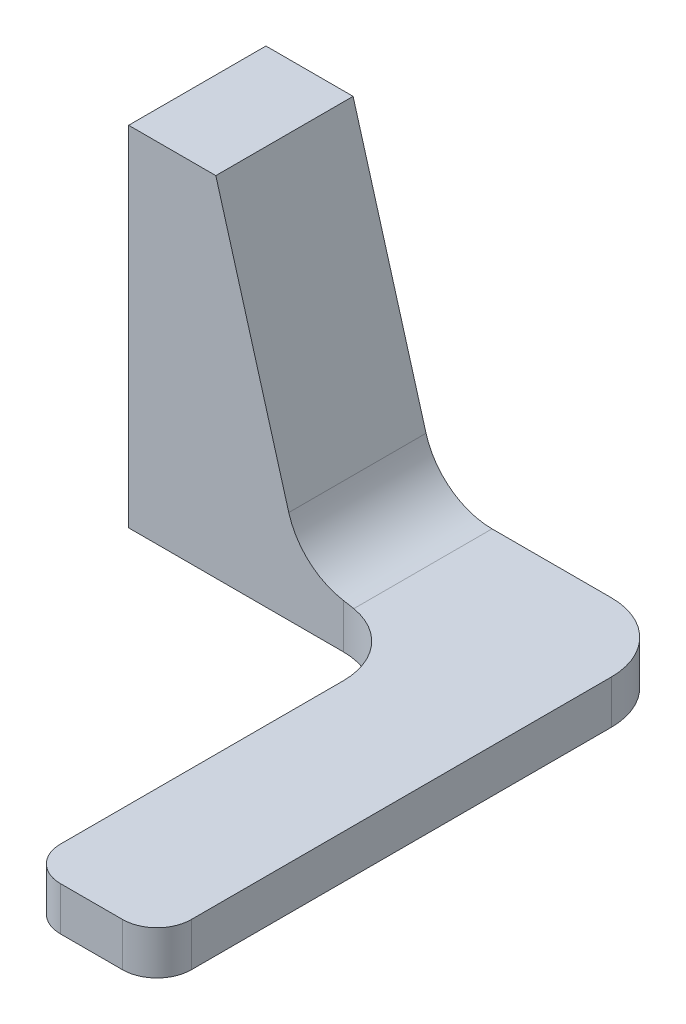
ISO-10303-21;
HEADER;
FILE_DESCRIPTION(('STEP AP214'),'2;1');
FILE_NAME('part.step','',(''),(''),'','','');
FILE_SCHEMA(('AUTOMOTIVE_DESIGN { 1 0 10303 214 1 1 1 1 }'));
ENDSEC;
DATA;
#1=APPLICATION_CONTEXT('core data for automotive mechanical design processes');
#2=APPLICATION_PROTOCOL_DEFINITION('international standard','automotive_design',2000,#1);
#3=PRODUCT_CONTEXT('',#1,'mechanical');
#4=PRODUCT('Part','Part','',(#3));
#5=PRODUCT_RELATED_PRODUCT_CATEGORY('part','',(#4));
#6=PRODUCT_DEFINITION_FORMATION('','',#4);
#7=PRODUCT_DEFINITION_CONTEXT('part definition',#1,'design');
#8=PRODUCT_DEFINITION('design','',#6,#7);
#9=PRODUCT_DEFINITION_SHAPE('','',#8);
#10=(LENGTH_UNIT() NAMED_UNIT(*) SI_UNIT(.MILLI.,.METRE.));
#11=(NAMED_UNIT(*) PLANE_ANGLE_UNIT() SI_UNIT($,.RADIAN.));
#12=(NAMED_UNIT(*) SI_UNIT($,.STERADIAN.) SOLID_ANGLE_UNIT());
#13=UNCERTAINTY_MEASURE_WITH_UNIT(LENGTH_MEASURE(1.E-05),#10,'distance_accuracy_value','');
#14=(GEOMETRIC_REPRESENTATION_CONTEXT(3) GLOBAL_UNCERTAINTY_ASSIGNED_CONTEXT((#13)) GLOBAL_UNIT_ASSIGNED_CONTEXT((#10,
#11,#12)) REPRESENTATION_CONTEXT('',''));
#15=CARTESIAN_POINT('',(0.,0.,0.));
#16=DIRECTION('',(0.,0.,1.));
#17=DIRECTION('',(1.,0.,0.));
#18=AXIS2_PLACEMENT_3D('',#15,#16,#17);
#19=CARTESIAN_POINT('',(41.275,50.8,10.));
#20=DIRECTION('',(0.,0.,-1.));
#21=DIRECTION('',(-1.,0.,0.));
#22=AXIS2_PLACEMENT_3D('',#19,#20,#21);
#23=PLANE('',#22);
#24=DIRECTION('',(1.,0.,0.));
#25=VECTOR('',#24,1.);
#26=CARTESIAN_POINT('',(41.275,0.,10.));
#27=LINE('',#26,#25);
#28=CARTESIAN_POINT('',(0.,0.,10.));
#29=VERTEX_POINT('',#28);
#30=CARTESIAN_POINT('',(31.275,0.,10.));
#31=VERTEX_POINT('',#30);
#32=EDGE_CURVE('E165',#29,#31,#27,.T.);
#33=ORIENTED_EDGE('',*,*,#32,.T.);
#34=DIRECTION('',(0.,-1.,0.));
#35=VECTOR('',#34,1.);
#36=CARTESIAN_POINT('',(31.275,6.35,10.));
#37=LINE('',#36,#35);
#38=CARTESIAN_POINT('',(31.275,6.49009488532902,10.));
#39=VERTEX_POINT('',#38);
#40=EDGE_CURVE('E198',#31,#39,#37,.F.);
#41=ORIENTED_EDGE('',*,*,#40,.T.);
#42=CARTESIAN_POINT('',(32.9430141275436,16.35,10.));
#43=DIRECTION('',(0.,0.,-1.));
#44=DIRECTION('',(-1.,0.,0.));
#45=AXIS2_PLACEMENT_3D('',#42,#43,#44);
#46=CIRCLE('',#45,10.);
#47=CARTESIAN_POINT('',(23.3277746511354,13.6027887210262,10.));
#48=VERTEX_POINT('',#47);
#49=EDGE_CURVE('E136',#39,#48,#46,.T.);
#50=ORIENTED_EDGE('',*,*,#49,.T.);
#51=DIRECTION('',(-0.274721127897378,0.961523947640823,0.));
#52=VECTOR('',#51,1.);
#53=CARTESIAN_POINT('',(14.8566037735849,43.2518867924528,10.));
#54=LINE('',#53,#52);
#55=CARTESIAN_POINT('',(12.7,50.8,9.99999999999999));
#56=VERTEX_POINT('',#55);
#57=EDGE_CURVE('E129',#48,#56,#54,.T.);
#58=ORIENTED_EDGE('',*,*,#57,.T.);
#59=DIRECTION('',(1.,0.,0.));
#60=VECTOR('',#59,1.);
#61=CARTESIAN_POINT('',(41.275,50.8,10.));
#62=LINE('',#61,#60);
#63=CARTESIAN_POINT('',(0.,50.8,10.));
#64=VERTEX_POINT('',#63);
#65=EDGE_CURVE('E134',#64,#56,#62,.T.);
#66=ORIENTED_EDGE('',*,*,#65,.F.);
#67=DIRECTION('',(0.,-1.,0.));
#68=VECTOR('',#67,1.);
#69=CARTESIAN_POINT('',(0.,50.8,10.));
#70=LINE('',#69,#68);
#71=EDGE_CURVE('E164',#64,#29,#70,.T.);
#72=ORIENTED_EDGE('',*,*,#71,.T.);
#73=EDGE_LOOP('',(#33,#41,#50,#58,#66,#72));
#74=FACE_BOUND('',#73,.T.);
#75=ADVANCED_FACE('F33',(#74),#23,.F.);
#76=CARTESIAN_POINT('',(41.275,50.8,66.2));
#77=DIRECTION('',(1.,0.,0.));
#78=DIRECTION('',(0.,0.,-1.));
#79=AXIS2_PLACEMENT_3D('',#76,#77,#78);
#80=PLANE('',#79);
#81=DIRECTION('',(0.,0.,1.));
#82=VECTOR('',#81,1.);
#83=CARTESIAN_POINT('',(41.275,0.,66.2));
#84=LINE('',#83,#82);
#85=CARTESIAN_POINT('',(41.275,0.,20.));
#86=VERTEX_POINT('',#85);
#87=CARTESIAN_POINT('',(41.275,0.,61.2));
#88=VERTEX_POINT('',#87);
#89=EDGE_CURVE('E167',#86,#88,#84,.T.);
#90=ORIENTED_EDGE('',*,*,#89,.T.);
#91=DIRECTION('',(0.,-1.,0.));
#92=VECTOR('',#91,1.);
#93=CARTESIAN_POINT('',(41.275,50.8,61.2));
#94=LINE('',#93,#92);
#95=CARTESIAN_POINT('',(41.275,6.35,61.2));
#96=VERTEX_POINT('',#95);
#97=EDGE_CURVE('E11',#88,#96,#94,.F.);
#98=ORIENTED_EDGE('',*,*,#97,.T.);
#99=DIRECTION('',(0.,0.,-1.));
#100=VECTOR('',#99,1.);
#101=CARTESIAN_POINT('',(41.275,6.35,66.2));
#102=LINE('',#101,#100);
#103=CARTESIAN_POINT('',(41.275,6.35,20.));
#104=VERTEX_POINT('',#103);
#105=EDGE_CURVE('E139',#96,#104,#102,.T.);
#106=ORIENTED_EDGE('',*,*,#105,.T.);
#107=DIRECTION('',(0.,-1.,0.));
#108=VECTOR('',#107,1.);
#109=CARTESIAN_POINT('',(41.275,0.,20.));
#110=LINE('',#109,#108);
#111=EDGE_CURVE('E195',#104,#86,#110,.T.);
#112=ORIENTED_EDGE('',*,*,#111,.T.);
#113=EDGE_LOOP('',(#90,#98,#106,#112));
#114=FACE_BOUND('',#113,.T.);
#115=ADVANCED_FACE('F230',(#114),#80,.F.);
#116=CARTESIAN_POINT('',(60.325,50.8,66.2));
#117=DIRECTION('',(0.,0.,-1.));
#118=DIRECTION('',(-1.,0.,0.));
#119=AXIS2_PLACEMENT_3D('',#116,#117,#118);
#120=PLANE('',#119);
#121=DIRECTION('',(1.,0.,0.));
#122=VECTOR('',#121,1.);
#123=CARTESIAN_POINT('',(60.325,0.,66.2));
#124=LINE('',#123,#122);
#125=CARTESIAN_POINT('',(46.275,0.,66.2));
#126=VERTEX_POINT('',#125);
#127=CARTESIAN_POINT('',(55.325,0.,66.2));
#128=VERTEX_POINT('',#127);
#129=EDGE_CURVE('E169',#126,#128,#124,.T.);
#130=ORIENTED_EDGE('',*,*,#129,.T.);
#131=DIRECTION('',(0.,-1.,0.));
#132=VECTOR('',#131,1.);
#133=CARTESIAN_POINT('',(55.325,50.8,66.2));
#134=LINE('',#133,#132);
#135=CARTESIAN_POINT('',(55.325,6.35,66.2));
#136=VERTEX_POINT('',#135);
#137=EDGE_CURVE('E54',#128,#136,#134,.F.);
#138=ORIENTED_EDGE('',*,*,#137,.T.);
#139=DIRECTION('',(1.,0.,0.));
#140=VECTOR('',#139,1.);
#141=CARTESIAN_POINT('',(25.4,6.35,66.2));
#142=LINE('',#141,#140);
#143=CARTESIAN_POINT('',(46.275,6.35,66.2));
#144=VERTEX_POINT('',#143);
#145=EDGE_CURVE('E264',#144,#136,#142,.T.);
#146=ORIENTED_EDGE('',*,*,#145,.F.);
#147=DIRECTION('',(0.,-1.,0.));
#148=VECTOR('',#147,1.);
#149=CARTESIAN_POINT('',(46.275,50.8,66.2));
#150=LINE('',#149,#148);
#151=EDGE_CURVE('E278',#144,#126,#150,.T.);
#152=ORIENTED_EDGE('',*,*,#151,.T.);
#153=EDGE_LOOP('',(#130,#138,#146,#152));
#154=FACE_BOUND('',#153,.T.);
#155=ADVANCED_FACE('F234',(#154),#120,.F.);
#156=CARTESIAN_POINT('',(60.325,50.8,-10.));
#157=DIRECTION('',(-1.,0.,0.));
#158=DIRECTION('',(0.,0.,1.));
#159=AXIS2_PLACEMENT_3D('',#156,#157,#158);
#160=PLANE('',#159);
#161=DIRECTION('',(0.,0.,1.));
#162=VECTOR('',#161,1.);
#163=CARTESIAN_POINT('',(60.325,6.35,-10.));
#164=LINE('',#163,#162);
#165=CARTESIAN_POINT('',(60.325,6.35,0.));
#166=VERTEX_POINT('',#165);
#167=CARTESIAN_POINT('',(60.325,6.35,61.2));
#168=VERTEX_POINT('',#167);
#169=EDGE_CURVE('E140',#166,#168,#164,.T.);
#170=ORIENTED_EDGE('',*,*,#169,.T.);
#171=DIRECTION('',(0.,-1.,0.));
#172=VECTOR('',#171,1.);
#173=CARTESIAN_POINT('',(60.325,50.8,61.2));
#174=LINE('',#173,#172);
#175=CARTESIAN_POINT('',(60.325,0.,61.2));
#176=VERTEX_POINT('',#175);
#177=EDGE_CURVE('E274',#168,#176,#174,.T.);
#178=ORIENTED_EDGE('',*,*,#177,.T.);
#179=DIRECTION('',(0.,0.,-1.));
#180=VECTOR('',#179,1.);
#181=CARTESIAN_POINT('',(60.325,0.,-10.));
#182=LINE('',#181,#180);
#183=CARTESIAN_POINT('',(60.325,0.,0.));
#184=VERTEX_POINT('',#183);
#185=EDGE_CURVE('E171',#176,#184,#182,.T.);
#186=ORIENTED_EDGE('',*,*,#185,.T.);
#187=DIRECTION('',(0.,-1.,0.));
#188=VECTOR('',#187,1.);
#189=CARTESIAN_POINT('',(60.325,50.8,0.));
#190=LINE('',#189,#188);
#191=EDGE_CURVE('E191',#184,#166,#190,.F.);
#192=ORIENTED_EDGE('',*,*,#191,.T.);
#193=EDGE_LOOP('',(#170,#178,#186,#192));
#194=FACE_BOUND('',#193,.T.);
#195=ADVANCED_FACE('F239',(#194),#160,.F.);
#196=CARTESIAN_POINT('',(0.,50.8,-10.));
#197=DIRECTION('',(0.,0.,1.));
#198=DIRECTION('',(1.,0.,0.));
#199=AXIS2_PLACEMENT_3D('',#196,#197,#198);
#200=PLANE('',#199);
#201=DIRECTION('',(1.,0.,0.));
#202=VECTOR('',#201,1.);
#203=CARTESIAN_POINT('',(25.4,6.35,-10.));
#204=LINE('',#203,#202);
#205=CARTESIAN_POINT('',(32.9430141275436,6.35,-10.));
#206=VERTEX_POINT('',#205);
#207=CARTESIAN_POINT('',(50.325,6.35,-10.));
#208=VERTEX_POINT('',#207);
#209=EDGE_CURVE('E149',#206,#208,#204,.T.);
#210=ORIENTED_EDGE('',*,*,#209,.T.);
#211=DIRECTION('',(0.,-1.,0.));
#212=VECTOR('',#211,1.);
#213=CARTESIAN_POINT('',(50.325,50.8,-10.));
#214=LINE('',#213,#212);
#215=CARTESIAN_POINT('',(50.325,0.,-10.));
#216=VERTEX_POINT('',#215);
#217=EDGE_CURVE('E185',#208,#216,#214,.T.);
#218=ORIENTED_EDGE('',*,*,#217,.T.);
#219=DIRECTION('',(-1.,0.,0.));
#220=VECTOR('',#219,1.);
#221=CARTESIAN_POINT('',(0.,0.,-10.));
#222=LINE('',#221,#220);
#223=CARTESIAN_POINT('',(0.,0.,-10.));
#224=VERTEX_POINT('',#223);
#225=EDGE_CURVE('E159',#216,#224,#222,.T.);
#226=ORIENTED_EDGE('',*,*,#225,.T.);
#227=DIRECTION('',(0.,-1.,0.));
#228=VECTOR('',#227,1.);
#229=CARTESIAN_POINT('',(0.,50.8,-10.));
#230=LINE('',#229,#228);
#231=CARTESIAN_POINT('',(0.,50.8,-10.));
#232=VERTEX_POINT('',#231);
#233=EDGE_CURVE('E175',#232,#224,#230,.T.);
#234=ORIENTED_EDGE('',*,*,#233,.F.);
#235=DIRECTION('',(-1.,0.,0.));
#236=VECTOR('',#235,1.);
#237=CARTESIAN_POINT('',(0.,50.8,-10.));
#238=LINE('',#237,#236);
#239=CARTESIAN_POINT('',(12.7,50.8,-10.));
#240=VERTEX_POINT('',#239);
#241=EDGE_CURVE('E155',#240,#232,#238,.T.);
#242=ORIENTED_EDGE('',*,*,#241,.F.);
#243=DIRECTION('',(0.274721127897378,-0.961523947640823,0.));
#244=VECTOR('',#243,1.);
#245=CARTESIAN_POINT('',(12.7,50.8,-10.));
#246=LINE('',#245,#244);
#247=CARTESIAN_POINT('',(23.3277746511354,13.6027887210262,-10.));
#248=VERTEX_POINT('',#247);
#249=EDGE_CURVE('E146',#240,#248,#246,.T.);
#250=ORIENTED_EDGE('',*,*,#249,.T.);
#251=CARTESIAN_POINT('',(32.9430141275436,16.35,-10.));
#252=DIRECTION('',(0.,0.,1.));
#253=DIRECTION('',(1.,0.,0.));
#254=AXIS2_PLACEMENT_3D('',#251,#252,#253);
#255=CIRCLE('',#254,10.);
#256=EDGE_CURVE('E183',#248,#206,#255,.T.);
#257=ORIENTED_EDGE('',*,*,#256,.T.);
#258=EDGE_LOOP('',(#210,#218,#226,#234,#242,#250,#257));
#259=FACE_BOUND('',#258,.T.);
#260=ADVANCED_FACE('F242',(#259),#200,.F.);
#261=CARTESIAN_POINT('',(0.,50.8,10.));
#262=DIRECTION('',(1.,0.,0.));
#263=DIRECTION('',(0.,0.,-1.));
#264=AXIS2_PLACEMENT_3D('',#261,#262,#263);
#265=PLANE('',#264);
#266=DIRECTION('',(0.,0.,1.));
#267=VECTOR('',#266,1.);
#268=CARTESIAN_POINT('',(0.,0.,10.));
#269=LINE('',#268,#267);
#270=EDGE_CURVE('E156',#224,#29,#269,.T.);
#271=ORIENTED_EDGE('',*,*,#270,.T.);
#272=ORIENTED_EDGE('',*,*,#71,.F.);
#273=DIRECTION('',(0.,0.,1.));
#274=VECTOR('',#273,1.);
#275=CARTESIAN_POINT('',(0.,50.8,10.));
#276=LINE('',#275,#274);
#277=EDGE_CURVE('E153',#232,#64,#276,.T.);
#278=ORIENTED_EDGE('',*,*,#277,.F.);
#279=ORIENTED_EDGE('',*,*,#233,.T.);
#280=EDGE_LOOP('',(#271,#272,#278,#279));
#281=FACE_BOUND('',#280,.T.);
#282=ADVANCED_FACE('F246',(#281),#265,.F.);
#283=CARTESIAN_POINT('',(0.,50.8,0.));
#284=DIRECTION('',(0.,-1.,0.));
#285=DIRECTION('',(0.,0.,-1.));
#286=AXIS2_PLACEMENT_3D('',#283,#284,#285);
#287=PLANE('',#286);
#288=ORIENTED_EDGE('',*,*,#65,.T.);
#289=DIRECTION('',(0.,0.,1.));
#290=VECTOR('',#289,1.);
#291=CARTESIAN_POINT('',(12.7,50.8,-10.));
#292=LINE('',#291,#290);
#293=EDGE_CURVE('E143',#240,#56,#292,.T.);
#294=ORIENTED_EDGE('',*,*,#293,.F.);
#295=ORIENTED_EDGE('',*,*,#241,.T.);
#296=ORIENTED_EDGE('',*,*,#277,.T.);
#297=EDGE_LOOP('',(#288,#294,#295,#296));
#298=FACE_BOUND('',#297,.T.);
#299=ADVANCED_FACE('F151',(#298),#287,.F.);
#300=CARTESIAN_POINT('',(0.,0.,0.));
#301=DIRECTION('',(0.,-1.,0.));
#302=DIRECTION('',(0.,0.,-1.));
#303=AXIS2_PLACEMENT_3D('',#300,#301,#302);
#304=PLANE('',#303);
#305=ORIENTED_EDGE('',*,*,#185,.F.);
#306=CARTESIAN_POINT('',(55.325,0.,61.2));
#307=DIRECTION('',(0.,-1.,0.));
#308=DIRECTION('',(0.,0.,-1.));
#309=AXIS2_PLACEMENT_3D('',#306,#307,#308);
#310=CIRCLE('',#309,5.);
#311=EDGE_CURVE('E280',#176,#128,#310,.T.);
#312=ORIENTED_EDGE('',*,*,#311,.T.);
#313=ORIENTED_EDGE('',*,*,#129,.F.);
#314=CARTESIAN_POINT('',(46.275,0.,61.2));
#315=DIRECTION('',(0.,-1.,0.));
#316=DIRECTION('',(0.,0.,-1.));
#317=AXIS2_PLACEMENT_3D('',#314,#315,#316);
#318=CIRCLE('',#317,5.);
#319=EDGE_CURVE('E282',#126,#88,#318,.T.);
#320=ORIENTED_EDGE('',*,*,#319,.T.);
#321=ORIENTED_EDGE('',*,*,#89,.F.);
#322=CARTESIAN_POINT('',(31.275,0.,20.));
#323=DIRECTION('',(0.,-1.,0.));
#324=DIRECTION('',(0.,0.,-1.));
#325=AXIS2_PLACEMENT_3D('',#322,#323,#324);
#326=CIRCLE('',#325,10.);
#327=EDGE_CURVE('E200',#86,#31,#326,.F.);
#328=ORIENTED_EDGE('',*,*,#327,.T.);
#329=ORIENTED_EDGE('',*,*,#32,.F.);
#330=ORIENTED_EDGE('',*,*,#270,.F.);
#331=ORIENTED_EDGE('',*,*,#225,.F.);
#332=CARTESIAN_POINT('',(50.325,0.,0.));
#333=DIRECTION('',(0.,-1.,0.));
#334=DIRECTION('',(0.,0.,-1.));
#335=AXIS2_PLACEMENT_3D('',#332,#333,#334);
#336=CIRCLE('',#335,10.);
#337=EDGE_CURVE('E188',#216,#184,#336,.T.);
#338=ORIENTED_EDGE('',*,*,#337,.T.);
#339=EDGE_LOOP('',(#305,#312,#313,#320,#321,#328,#329,#330,#331,#338));
#340=FACE_BOUND('',#339,.T.);
#341=ADVANCED_FACE('F251',(#340),#304,.T.);
#342=CARTESIAN_POINT('',(25.4,6.35,-10.));
#343=DIRECTION('',(0.,-1.,0.));
#344=DIRECTION('',(1.,0.,0.));
#345=AXIS2_PLACEMENT_3D('',#342,#343,#344);
#346=PLANE('',#345);
#347=ORIENTED_EDGE('',*,*,#145,.T.);
#348=CARTESIAN_POINT('',(55.325,6.35,61.2));
#349=DIRECTION('',(0.,-1.,0.));
#350=DIRECTION('',(1.,0.,0.));
#351=AXIS2_PLACEMENT_3D('',#348,#349,#350);
#352=CIRCLE('',#351,5.);
#353=EDGE_CURVE('E41',#136,#168,#352,.F.);
#354=ORIENTED_EDGE('',*,*,#353,.T.);
#355=ORIENTED_EDGE('',*,*,#169,.F.);
#356=CARTESIAN_POINT('',(50.325,6.35,0.));
#357=DIRECTION('',(0.,-1.,0.));
#358=DIRECTION('',(1.,0.,0.));
#359=AXIS2_PLACEMENT_3D('',#356,#357,#358);
#360=CIRCLE('',#359,10.);
#361=EDGE_CURVE('E193',#166,#208,#360,.F.);
#362=ORIENTED_EDGE('',*,*,#361,.T.);
#363=ORIENTED_EDGE('',*,*,#209,.F.);
#364=DIRECTION('',(0.,0.,1.));
#365=VECTOR('',#364,1.);
#366=CARTESIAN_POINT('',(32.9430141275436,6.35,9.99999999999999));
#367=LINE('',#366,#365);
#368=CARTESIAN_POINT('',(32.9430141275436,6.35,10.140094885329));
#369=VERTEX_POINT('',#368);
#370=EDGE_CURVE('E178',#206,#369,#367,.T.);
#371=ORIENTED_EDGE('',*,*,#370,.T.);
#372=CARTESIAN_POINT('',(31.275,6.35,20.));
#373=DIRECTION('',(0.,-1.,0.));
#374=DIRECTION('',(1.,0.,0.));
#375=AXIS2_PLACEMENT_3D('',#372,#373,#374);
#376=CIRCLE('',#375,10.);
#377=EDGE_CURVE('E210',#369,#104,#376,.T.);
#378=ORIENTED_EDGE('',*,*,#377,.T.);
#379=ORIENTED_EDGE('',*,*,#105,.F.);
#380=CARTESIAN_POINT('',(46.275,6.35,61.2));
#381=DIRECTION('',(0.,-1.,0.));
#382=DIRECTION('',(1.,0.,0.));
#383=AXIS2_PLACEMENT_3D('',#380,#381,#382);
#384=CIRCLE('',#383,5.);
#385=EDGE_CURVE('E268',#96,#144,#384,.F.);
#386=ORIENTED_EDGE('',*,*,#385,.T.);
#387=EDGE_LOOP('',(#347,#354,#355,#362,#363,#371,#378,#379,#386));
#388=FACE_BOUND('',#387,.T.);
#389=ADVANCED_FACE('F254',(#388),#346,.F.);
#390=CARTESIAN_POINT('',(12.7,50.8,-10.));
#391=DIRECTION('',(-0.961523947640823,-0.274721127897378,0.));
#392=DIRECTION('',(0.274721127897378,-0.961523947640823,0.));
#393=AXIS2_PLACEMENT_3D('',#390,#391,#392);
#394=PLANE('',#393);
#395=ORIENTED_EDGE('',*,*,#57,.F.);
#396=DIRECTION('',(0.,0.,1.));
#397=VECTOR('',#396,1.);
#398=CARTESIAN_POINT('',(23.3277746511354,13.6027887210262,-10.));
#399=LINE('',#398,#397);
#400=EDGE_CURVE('E180',#48,#248,#399,.F.);
#401=ORIENTED_EDGE('',*,*,#400,.T.);
#402=ORIENTED_EDGE('',*,*,#249,.F.);
#403=ORIENTED_EDGE('',*,*,#293,.T.);
#404=EDGE_LOOP('',(#395,#401,#402,#403));
#405=FACE_BOUND('',#404,.T.);
#406=ADVANCED_FACE('F144',(#405),#394,.F.);
#407=CARTESIAN_POINT('',(32.9430141275436,16.35,-10.));
#408=DIRECTION('',(0.,0.,-1.));
#409=DIRECTION('',(-1.,0.,0.));
#410=AXIS2_PLACEMENT_3D('',#407,#408,#409);
#411=CYLINDRICAL_SURFACE('',#410,10.);
#412=ORIENTED_EDGE('',*,*,#256,.F.);
#413=ORIENTED_EDGE('',*,*,#400,.F.);
#414=ORIENTED_EDGE('',*,*,#49,.F.);
#415=CARTESIAN_POINT('',(31.275,6.49009488532902,10.));
#416=CARTESIAN_POINT('',(31.4135797606448,6.46664229317455,9.99999136757475));
#417=CARTESIAN_POINT('',(31.5526588676189,6.44612818718058,10.002880682524));
#418=CARTESIAN_POINT('',(31.830828829855,6.41105721147411,10.0144943949173));
#419=CARTESIAN_POINT('',(31.9699179468134,6.39647978132522,10.0231983730468));
#420=CARTESIAN_POINT('',(32.2480961807302,6.37319837304682,10.0464797813252));
#421=CARTESIAN_POINT('',(32.3871852976886,6.36449439491729,10.0610572114741));
#422=CARTESIAN_POINT('',(32.6653552599247,6.35288068252403,10.0961281871806));
#423=CARTESIAN_POINT('',(32.8044343668988,6.34999136757474,10.1166422931746));
#424=CARTESIAN_POINT('',(32.9430141275436,6.35,10.140094885329));
#425=B_SPLINE_CURVE_WITH_KNOTS('',3,(#415,#416,#417,#418,#419,#420,#421,#422,#423,#424),
.UNSPECIFIED.,.F.,.F.,(4,2,2,2,4),(0.,0.421592549657572,0.841712323993387,1.2618320983292,
1.68342464798677),.UNSPECIFIED.);
#426=EDGE_CURVE('E202',#39,#369,#425,.T.);
#427=ORIENTED_EDGE('',*,*,#426,.T.);
#428=ORIENTED_EDGE('',*,*,#370,.F.);
#429=EDGE_LOOP('',(#412,#413,#414,#427,#428));
#430=FACE_BOUND('',#429,.T.);
#431=ADVANCED_FACE('F212',(#430),#411,.F.);
#432=CARTESIAN_POINT('',(50.325,50.8,0.));
#433=DIRECTION('',(0.,-1.,0.));
#434=DIRECTION('',(0.,0.,-1.));
#435=AXIS2_PLACEMENT_3D('',#432,#433,#434);
#436=CYLINDRICAL_SURFACE('',#435,10.);
#437=ORIENTED_EDGE('',*,*,#361,.F.);
#438=ORIENTED_EDGE('',*,*,#191,.F.);
#439=ORIENTED_EDGE('',*,*,#337,.F.);
#440=ORIENTED_EDGE('',*,*,#217,.F.);
#441=EDGE_LOOP('',(#437,#438,#439,#440));
#442=FACE_BOUND('',#441,.T.);
#443=ADVANCED_FACE('F220',(#442),#436,.T.);
#444=CARTESIAN_POINT('',(31.275,50.8,20.));
#445=DIRECTION('',(0.,1.,0.));
#446=DIRECTION('',(0.,0.,1.));
#447=AXIS2_PLACEMENT_3D('',#444,#445,#446);
#448=CYLINDRICAL_SURFACE('',#447,10.);
#449=ORIENTED_EDGE('',*,*,#426,.F.);
#450=ORIENTED_EDGE('',*,*,#40,.F.);
#451=ORIENTED_EDGE('',*,*,#327,.F.);
#452=ORIENTED_EDGE('',*,*,#111,.F.);
#453=ORIENTED_EDGE('',*,*,#377,.F.);
#454=EDGE_LOOP('',(#449,#450,#451,#452,#453));
#455=FACE_BOUND('',#454,.T.);
#456=ADVANCED_FACE('F216',(#455),#448,.F.);
#457=CARTESIAN_POINT('',(55.325,50.8,61.2));
#458=DIRECTION('',(0.,-1.,0.));
#459=DIRECTION('',(0.,0.,-1.));
#460=AXIS2_PLACEMENT_3D('',#457,#458,#459);
#461=CYLINDRICAL_SURFACE('',#460,5.);
#462=ORIENTED_EDGE('',*,*,#353,.F.);
#463=ORIENTED_EDGE('',*,*,#137,.F.);
#464=ORIENTED_EDGE('',*,*,#311,.F.);
#465=ORIENTED_EDGE('',*,*,#177,.F.);
#466=EDGE_LOOP('',(#462,#463,#464,#465));
#467=FACE_BOUND('',#466,.T.);
#468=ADVANCED_FACE('F219',(#467),#461,.T.);
#469=CARTESIAN_POINT('',(46.275,50.8,61.2));
#470=DIRECTION('',(0.,-1.,0.));
#471=DIRECTION('',(0.,0.,-1.));
#472=AXIS2_PLACEMENT_3D('',#469,#470,#471);
#473=CYLINDRICAL_SURFACE('',#472,5.);
#474=ORIENTED_EDGE('',*,*,#385,.F.);
#475=ORIENTED_EDGE('',*,*,#97,.F.);
#476=ORIENTED_EDGE('',*,*,#319,.F.);
#477=ORIENTED_EDGE('',*,*,#151,.F.);
#478=EDGE_LOOP('',(#474,#475,#476,#477));
#479=FACE_BOUND('',#478,.T.);
#480=ADVANCED_FACE('F35',(#479),#473,.T.);
#481=CLOSED_SHELL('',(#75,#115,#155,#195,#260,#282,#299,#341,#389,#406,#431,#443,#456,#468,#480));
#482=MANIFOLD_SOLID_BREP('B2',#481);
#483=ADVANCED_BREP_SHAPE_REPRESENTATION('',(#18,#482),#14);
#484=SHAPE_DEFINITION_REPRESENTATION(#9,#483);
ENDSEC;
END-ISO-10303-21;
